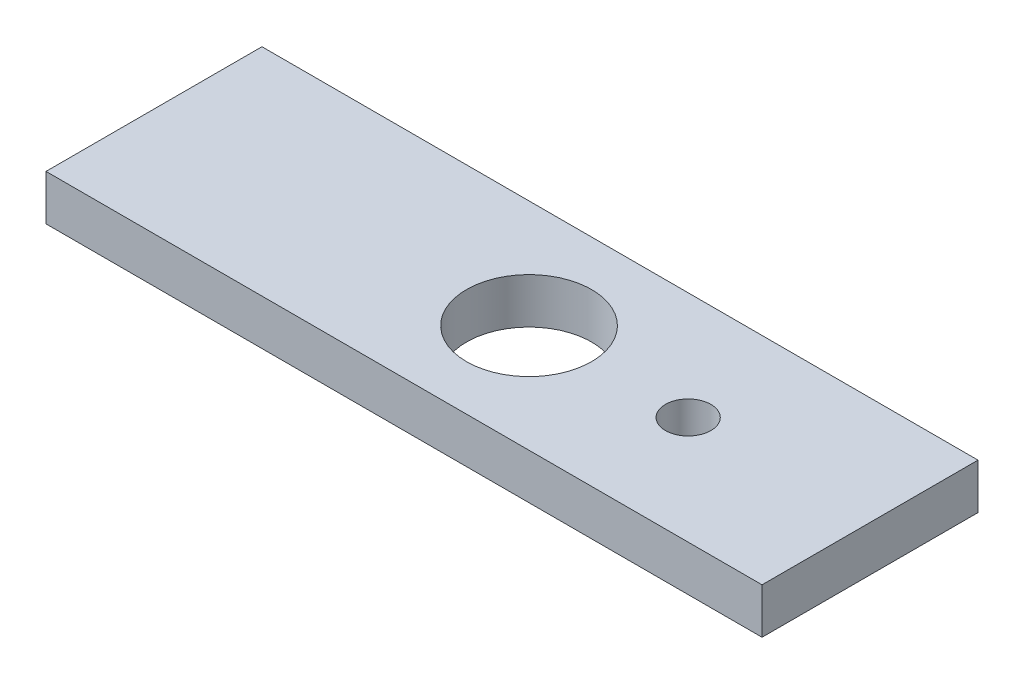
ISO-10303-21;
HEADER;
FILE_DESCRIPTION(('STEP AP214'),'2;1');
FILE_NAME('part.step','',(''),(''),'','','');
FILE_SCHEMA(('AUTOMOTIVE_DESIGN { 1 0 10303 214 1 1 1 1 }'));
ENDSEC;
DATA;
#1=APPLICATION_CONTEXT('core data for automotive mechanical design processes');
#2=APPLICATION_PROTOCOL_DEFINITION('international standard','automotive_design',2000,#1);
#3=PRODUCT_CONTEXT('',#1,'mechanical');
#4=PRODUCT('Part','Part','',(#3));
#5=PRODUCT_RELATED_PRODUCT_CATEGORY('part','',(#4));
#6=PRODUCT_DEFINITION_FORMATION('','',#4);
#7=PRODUCT_DEFINITION_CONTEXT('part definition',#1,'design');
#8=PRODUCT_DEFINITION('design','',#6,#7);
#9=PRODUCT_DEFINITION_SHAPE('','',#8);
#10=(LENGTH_UNIT() NAMED_UNIT(*) SI_UNIT(.MILLI.,.METRE.));
#11=(NAMED_UNIT(*) PLANE_ANGLE_UNIT() SI_UNIT($,.RADIAN.));
#12=(NAMED_UNIT(*) SI_UNIT($,.STERADIAN.) SOLID_ANGLE_UNIT());
#13=UNCERTAINTY_MEASURE_WITH_UNIT(LENGTH_MEASURE(1.E-05),#10,'distance_accuracy_value','');
#14=(GEOMETRIC_REPRESENTATION_CONTEXT(3) GLOBAL_UNCERTAINTY_ASSIGNED_CONTEXT((#13)) GLOBAL_UNIT_ASSIGNED_CONTEXT((#10,
#11,#12)) REPRESENTATION_CONTEXT('',''));
#15=CARTESIAN_POINT('',(0.,0.,0.));
#16=DIRECTION('',(0.,0.,1.));
#17=DIRECTION('',(1.,0.,0.));
#18=AXIS2_PLACEMENT_3D('',#15,#16,#17);
#19=CARTESIAN_POINT('',(31.5,4.,9.5));
#20=DIRECTION('',(-1.,0.,0.));
#21=DIRECTION('',(0.,0.,1.));
#22=AXIS2_PLACEMENT_3D('',#19,#20,#21);
#23=PLANE('',#22);
#24=DIRECTION('',(0.,0.,-1.));
#25=VECTOR('',#24,1.);
#26=CARTESIAN_POINT('',(31.5,0.,9.5));
#27=LINE('',#26,#25);
#28=CARTESIAN_POINT('',(31.5,0.,9.5));
#29=VERTEX_POINT('',#28);
#30=CARTESIAN_POINT('',(31.5,0.,-9.5));
#31=VERTEX_POINT('',#30);
#32=EDGE_CURVE('E97',#29,#31,#27,.T.);
#33=ORIENTED_EDGE('',*,*,#32,.T.);
#34=DIRECTION('',(0.,-1.,0.));
#35=VECTOR('',#34,1.);
#36=CARTESIAN_POINT('',(31.5,4.,-9.5));
#37=LINE('',#36,#35);
#38=CARTESIAN_POINT('',(31.5,4.,-9.5));
#39=VERTEX_POINT('',#38);
#40=EDGE_CURVE('E11',#39,#31,#37,.T.);
#41=ORIENTED_EDGE('',*,*,#40,.F.);
#42=DIRECTION('',(0.,0.,-1.));
#43=VECTOR('',#42,1.);
#44=CARTESIAN_POINT('',(31.5,4.,9.5));
#45=LINE('',#44,#43);
#46=CARTESIAN_POINT('',(31.5,4.,9.5));
#47=VERTEX_POINT('',#46);
#48=EDGE_CURVE('E85',#47,#39,#45,.T.);
#49=ORIENTED_EDGE('',*,*,#48,.F.);
#50=DIRECTION('',(0.,-1.,0.));
#51=VECTOR('',#50,1.);
#52=CARTESIAN_POINT('',(31.5,4.,9.5));
#53=LINE('',#52,#51);
#54=EDGE_CURVE('E93',#47,#29,#53,.T.);
#55=ORIENTED_EDGE('',*,*,#54,.T.);
#56=EDGE_LOOP('',(#33,#41,#49,#55));
#57=FACE_BOUND('',#56,.T.);
#58=ADVANCED_FACE('F34',(#57),#23,.F.);
#59=CARTESIAN_POINT('',(-31.5,4.,-9.5));
#60=DIRECTION('',(0.,0.,1.));
#61=DIRECTION('',(1.,0.,0.));
#62=AXIS2_PLACEMENT_3D('',#59,#60,#61);
#63=PLANE('',#62);
#64=DIRECTION('',(-1.,0.,0.));
#65=VECTOR('',#64,1.);
#66=CARTESIAN_POINT('',(-31.5,0.,-9.5));
#67=LINE('',#66,#65);
#68=CARTESIAN_POINT('',(-31.5,0.,-9.5));
#69=VERTEX_POINT('',#68);
#70=EDGE_CURVE('E89',#31,#69,#67,.T.);
#71=ORIENTED_EDGE('',*,*,#70,.T.);
#72=DIRECTION('',(0.,-1.,0.));
#73=VECTOR('',#72,1.);
#74=CARTESIAN_POINT('',(-31.5,4.,-9.5));
#75=LINE('',#74,#73);
#76=CARTESIAN_POINT('',(-31.5,4.,-9.5));
#77=VERTEX_POINT('',#76);
#78=EDGE_CURVE('E42',#77,#69,#75,.T.);
#79=ORIENTED_EDGE('',*,*,#78,.F.);
#80=DIRECTION('',(-1.,0.,0.));
#81=VECTOR('',#80,1.);
#82=CARTESIAN_POINT('',(-31.5,4.,-9.5));
#83=LINE('',#82,#81);
#84=EDGE_CURVE('E80',#39,#77,#83,.T.);
#85=ORIENTED_EDGE('',*,*,#84,.F.);
#86=ORIENTED_EDGE('',*,*,#40,.T.);
#87=EDGE_LOOP('',(#71,#79,#85,#86));
#88=FACE_BOUND('',#87,.T.);
#89=ADVANCED_FACE('F88',(#88),#63,.F.);
#90=CARTESIAN_POINT('',(-31.5,4.,9.5));
#91=DIRECTION('',(1.,0.,0.));
#92=DIRECTION('',(0.,0.,-1.));
#93=AXIS2_PLACEMENT_3D('',#90,#91,#92);
#94=PLANE('',#93);
#95=DIRECTION('',(0.,0.,1.));
#96=VECTOR('',#95,1.);
#97=CARTESIAN_POINT('',(-31.5,0.,9.5));
#98=LINE('',#97,#96);
#99=CARTESIAN_POINT('',(-31.5,0.,9.5));
#100=VERTEX_POINT('',#99);
#101=EDGE_CURVE('E67',#69,#100,#98,.T.);
#102=ORIENTED_EDGE('',*,*,#101,.T.);
#103=DIRECTION('',(0.,-1.,0.));
#104=VECTOR('',#103,1.);
#105=CARTESIAN_POINT('',(-31.5,4.,9.5));
#106=LINE('',#105,#104);
#107=CARTESIAN_POINT('',(-31.5,4.,9.5));
#108=VERTEX_POINT('',#107);
#109=EDGE_CURVE('E90',#108,#100,#106,.T.);
#110=ORIENTED_EDGE('',*,*,#109,.F.);
#111=DIRECTION('',(0.,0.,1.));
#112=VECTOR('',#111,1.);
#113=CARTESIAN_POINT('',(-31.5,4.,9.5));
#114=LINE('',#113,#112);
#115=EDGE_CURVE('E83',#77,#108,#114,.T.);
#116=ORIENTED_EDGE('',*,*,#115,.F.);
#117=ORIENTED_EDGE('',*,*,#78,.T.);
#118=EDGE_LOOP('',(#102,#110,#116,#117));
#119=FACE_BOUND('',#118,.T.);
#120=ADVANCED_FACE('F91',(#119),#94,.F.);
#121=CARTESIAN_POINT('',(-31.5,4.,9.5));
#122=DIRECTION('',(0.,0.,-1.));
#123=DIRECTION('',(-1.,0.,0.));
#124=AXIS2_PLACEMENT_3D('',#121,#122,#123);
#125=PLANE('',#124);
#126=DIRECTION('',(1.,0.,0.));
#127=VECTOR('',#126,1.);
#128=CARTESIAN_POINT('',(-31.5,0.,9.5));
#129=LINE('',#128,#127);
#130=EDGE_CURVE('E73',#100,#29,#129,.T.);
#131=ORIENTED_EDGE('',*,*,#130,.T.);
#132=ORIENTED_EDGE('',*,*,#54,.F.);
#133=DIRECTION('',(1.,0.,0.));
#134=VECTOR('',#133,1.);
#135=CARTESIAN_POINT('',(-31.5,4.,9.5));
#136=LINE('',#135,#134);
#137=EDGE_CURVE('E50',#108,#47,#136,.T.);
#138=ORIENTED_EDGE('',*,*,#137,.F.);
#139=ORIENTED_EDGE('',*,*,#109,.T.);
#140=EDGE_LOOP('',(#131,#132,#138,#139));
#141=FACE_BOUND('',#140,.T.);
#142=ADVANCED_FACE('F105',(#141),#125,.F.);
#143=CARTESIAN_POINT('',(0.,4.,0.));
#144=DIRECTION('',(0.,-1.,0.));
#145=DIRECTION('',(0.,0.,-1.));
#146=AXIS2_PLACEMENT_3D('',#143,#144,#145);
#147=PLANE('',#146);
#148=CARTESIAN_POINT('',(1.49999999999999,4.,0.));
#149=DIRECTION('',(0.,1.,0.));
#150=DIRECTION('',(0.,0.,1.));
#151=AXIS2_PLACEMENT_3D('',#148,#149,#150);
#152=CIRCLE('',#151,5.5);
#153=CARTESIAN_POINT('',(1.49999999999999,4.,5.5));
#154=VERTEX_POINT('',#153);
#155=EDGE_CURVE('E117',#154,#154,#152,.T.);
#156=ORIENTED_EDGE('',*,*,#155,.F.);
#157=EDGE_LOOP('',(#156));
#158=FACE_BOUND('',#157,.T.);
#159=CARTESIAN_POINT('',(15.5,4.,0.));
#160=DIRECTION('',(0.,1.,0.));
#161=DIRECTION('',(0.,0.,1.));
#162=AXIS2_PLACEMENT_3D('',#159,#160,#161);
#163=CIRCLE('',#162,2.);
#164=CARTESIAN_POINT('',(15.5,4.,2.00000000000001));
#165=VERTEX_POINT('',#164);
#166=EDGE_CURVE('E111',#165,#165,#163,.T.);
#167=ORIENTED_EDGE('',*,*,#166,.F.);
#168=EDGE_LOOP('',(#167));
#169=FACE_BOUND('',#168,.T.);
#170=ORIENTED_EDGE('',*,*,#48,.T.);
#171=ORIENTED_EDGE('',*,*,#84,.T.);
#172=ORIENTED_EDGE('',*,*,#115,.T.);
#173=ORIENTED_EDGE('',*,*,#137,.T.);
#174=EDGE_LOOP('',(#170,#171,#172,#173));
#175=FACE_BOUND('',#174,.T.);
#176=ADVANCED_FACE('F81',(#158,#169,#175),#147,.F.);
#177=CARTESIAN_POINT('',(0.,0.,0.));
#178=DIRECTION('',(0.,-1.,0.));
#179=DIRECTION('',(0.,0.,-1.));
#180=AXIS2_PLACEMENT_3D('',#177,#178,#179);
#181=PLANE('',#180);
#182=CARTESIAN_POINT('',(1.49999999999999,0.,0.));
#183=DIRECTION('',(0.,1.,0.));
#184=DIRECTION('',(0.,0.,1.));
#185=AXIS2_PLACEMENT_3D('',#182,#183,#184);
#186=CIRCLE('',#185,5.5);
#187=CARTESIAN_POINT('',(1.49999999999999,0.,5.5));
#188=VERTEX_POINT('',#187);
#189=EDGE_CURVE('E100',#188,#188,#186,.T.);
#190=ORIENTED_EDGE('',*,*,#189,.T.);
#191=EDGE_LOOP('',(#190));
#192=FACE_BOUND('',#191,.T.);
#193=CARTESIAN_POINT('',(15.5,0.,0.));
#194=DIRECTION('',(0.,1.,0.));
#195=DIRECTION('',(0.,0.,1.));
#196=AXIS2_PLACEMENT_3D('',#193,#194,#195);
#197=CIRCLE('',#196,2.);
#198=CARTESIAN_POINT('',(15.5,0.,2.00000000000001));
#199=VERTEX_POINT('',#198);
#200=EDGE_CURVE('E114',#199,#199,#197,.T.);
#201=ORIENTED_EDGE('',*,*,#200,.T.);
#202=EDGE_LOOP('',(#201));
#203=FACE_BOUND('',#202,.T.);
#204=ORIENTED_EDGE('',*,*,#32,.F.);
#205=ORIENTED_EDGE('',*,*,#130,.F.);
#206=ORIENTED_EDGE('',*,*,#101,.F.);
#207=ORIENTED_EDGE('',*,*,#70,.F.);
#208=EDGE_LOOP('',(#204,#205,#206,#207));
#209=FACE_BOUND('',#208,.T.);
#210=ADVANCED_FACE('F108',(#192,#203,#209),#181,.T.);
#211=CARTESIAN_POINT('',(15.5,0.,0.));
#212=DIRECTION('',(0.,1.,0.));
#213=DIRECTION('',(0.,0.,1.));
#214=AXIS2_PLACEMENT_3D('',#211,#212,#213);
#215=CYLINDRICAL_SURFACE('',#214,2.);
#216=ORIENTED_EDGE('',*,*,#200,.F.);
#217=EDGE_LOOP('',(#216));
#218=FACE_BOUND('',#217,.T.);
#219=ORIENTED_EDGE('',*,*,#166,.T.);
#220=EDGE_LOOP('',(#219));
#221=FACE_BOUND('',#220,.T.);
#222=ADVANCED_FACE('F128',(#218,#221),#215,.F.);
#223=CARTESIAN_POINT('',(1.49999999999999,0.,0.));
#224=DIRECTION('',(0.,1.,0.));
#225=DIRECTION('',(0.,0.,1.));
#226=AXIS2_PLACEMENT_3D('',#223,#224,#225);
#227=CYLINDRICAL_SURFACE('',#226,5.5);
#228=ORIENTED_EDGE('',*,*,#189,.F.);
#229=EDGE_LOOP('',(#228));
#230=FACE_BOUND('',#229,.T.);
#231=ORIENTED_EDGE('',*,*,#155,.T.);
#232=EDGE_LOOP('',(#231));
#233=FACE_BOUND('',#232,.T.);
#234=ADVANCED_FACE('F125',(#230,#233),#227,.F.);
#235=CLOSED_SHELL('',(#58,#89,#120,#142,#176,#210,#222,#234));
#236=MANIFOLD_SOLID_BREP('B2',#235);
#237=ADVANCED_BREP_SHAPE_REPRESENTATION('',(#18,#236),#14);
#238=SHAPE_DEFINITION_REPRESENTATION(#9,#237);
ENDSEC;
END-ISO-10303-21;
